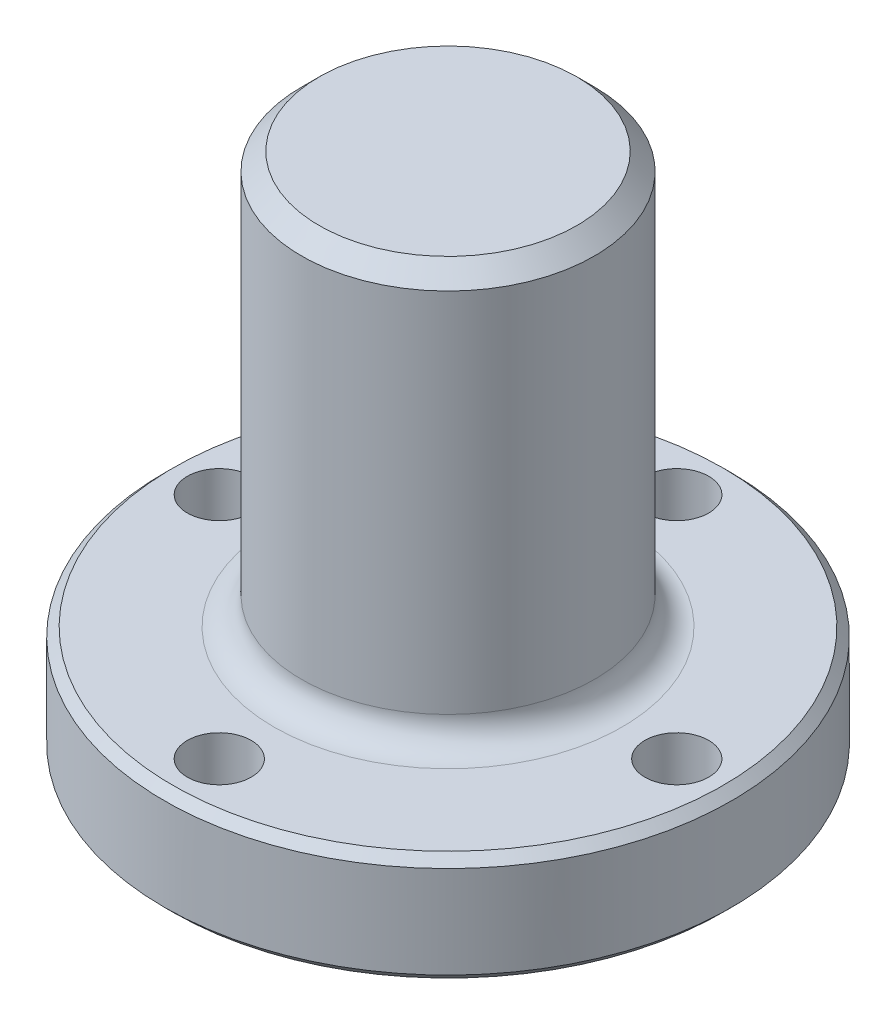
ISO-10303-21;
HEADER;
FILE_DESCRIPTION(('STEP AP214'),'2;1');
FILE_NAME('part.step','',(''),(''),'','','');
FILE_SCHEMA(('AUTOMOTIVE_DESIGN { 1 0 10303 214 1 1 1 1 }'));
ENDSEC;
DATA;
#1=APPLICATION_CONTEXT('core data for automotive mechanical design processes');
#2=APPLICATION_PROTOCOL_DEFINITION('international standard','automotive_design',2000,#1);
#3=PRODUCT_CONTEXT('',#1,'mechanical');
#4=PRODUCT('Part','Part','',(#3));
#5=PRODUCT_RELATED_PRODUCT_CATEGORY('part','',(#4));
#6=PRODUCT_DEFINITION_FORMATION('','',#4);
#7=PRODUCT_DEFINITION_CONTEXT('part definition',#1,'design');
#8=PRODUCT_DEFINITION('design','',#6,#7);
#9=PRODUCT_DEFINITION_SHAPE('','',#8);
#10=(LENGTH_UNIT() NAMED_UNIT(*) SI_UNIT(.MILLI.,.METRE.));
#11=(NAMED_UNIT(*) PLANE_ANGLE_UNIT() SI_UNIT($,.RADIAN.));
#12=(NAMED_UNIT(*) SI_UNIT($,.STERADIAN.) SOLID_ANGLE_UNIT());
#13=UNCERTAINTY_MEASURE_WITH_UNIT(LENGTH_MEASURE(1.E-05),#10,'distance_accuracy_value','');
#14=(GEOMETRIC_REPRESENTATION_CONTEXT(3) GLOBAL_UNCERTAINTY_ASSIGNED_CONTEXT((#13)) GLOBAL_UNIT_ASSIGNED_CONTEXT((#10,
#11,#12)) REPRESENTATION_CONTEXT('',''));
#15=CARTESIAN_POINT('',(0.,0.,0.));
#16=DIRECTION('',(0.,0.,1.));
#17=DIRECTION('',(1.,0.,0.));
#18=AXIS2_PLACEMENT_3D('',#15,#16,#17);
#19=CARTESIAN_POINT('',(0.,-25.0317,0.));
#20=DIRECTION('',(0.,1.,0.));
#21=DIRECTION('',(0.,0.,1.));
#22=AXIS2_PLACEMENT_3D('',#19,#20,#21);
#23=PLANE('',#22);
#24=CARTESIAN_POINT('',(0.,-25.0317,0.));
#25=DIRECTION('',(0.,-1.,0.));
#26=DIRECTION('',(0.,0.,-1.));
#27=AXIS2_PLACEMENT_3D('',#24,#25,#26);
#28=CIRCLE('',#27,8.7122);
#29=CARTESIAN_POINT('',(0.,-25.0317,-8.7122));
#30=VERTEX_POINT('',#29);
#31=EDGE_CURVE('E76',#30,#30,#28,.T.);
#32=ORIENTED_EDGE('',*,*,#31,.T.);
#33=EDGE_LOOP('',(#32));
#34=FACE_BOUND('',#33,.T.);
#35=ADVANCED_FACE('F43',(#34),#23,.F.);
#36=CARTESIAN_POINT('',(0.,-50.4317,0.));
#37=DIRECTION('',(0.,-1.,0.));
#38=DIRECTION('',(0.,0.,-1.));
#39=AXIS2_PLACEMENT_3D('',#36,#37,#38);
#40=CYLINDRICAL_SURFACE('',#39,8.7122);
#41=ORIENTED_EDGE('',*,*,#31,.F.);
#42=EDGE_LOOP('',(#41));
#43=FACE_BOUND('',#42,.T.);
#44=CARTESIAN_POINT('',(0.,-20.2057,0.));
#45=DIRECTION('',(0.,-1.,0.));
#46=DIRECTION('',(0.,0.,-1.));
#47=AXIS2_PLACEMENT_3D('',#44,#45,#46);
#48=CIRCLE('',#47,8.7122);
#49=CARTESIAN_POINT('',(0.,-20.2057,-8.7122));
#50=VERTEX_POINT('',#49);
#51=EDGE_CURVE('E79',#50,#50,#48,.T.);
#52=ORIENTED_EDGE('',*,*,#51,.T.);
#53=EDGE_LOOP('',(#52));
#54=FACE_BOUND('',#53,.T.);
#55=ADVANCED_FACE('F147',(#43,#54),#40,.T.);
#56=CARTESIAN_POINT('',(-8.7122,-20.2057,0.));
#57=DIRECTION('',(0.,1.,0.));
#58=DIRECTION('',(0.,0.,1.));
#59=AXIS2_PLACEMENT_3D('',#56,#57,#58);
#60=PLANE('',#59);
#61=CARTESIAN_POINT('',(0.,-20.2057,0.));
#62=DIRECTION('',(0.,1.,0.));
#63=DIRECTION('',(0.,0.,1.));
#64=AXIS2_PLACEMENT_3D('',#61,#62,#63);
#65=CIRCLE('',#64,23.8506);
#66=CARTESIAN_POINT('',(0.,-20.2057,23.8506));
#67=VERTEX_POINT('',#66);
#68=EDGE_CURVE('E55',#67,#67,#65,.F.);
#69=ORIENTED_EDGE('',*,*,#68,.T.);
#70=EDGE_LOOP('',(#69));
#71=FACE_BOUND('',#70,.T.);
#72=CARTESIAN_POINT('',(-19.8374,-20.2057,0.));
#73=DIRECTION('',(0.,1.,0.));
#74=DIRECTION('',(0.,0.,1.));
#75=AXIS2_PLACEMENT_3D('',#72,#73,#74);
#76=CIRCLE('',#75,2.7686);
#77=CARTESIAN_POINT('',(-19.8374,-20.2057,2.7686));
#78=VERTEX_POINT('',#77);
#79=EDGE_CURVE('E82',#78,#78,#76,.T.);
#80=ORIENTED_EDGE('',*,*,#79,.T.);
#81=EDGE_LOOP('',(#80));
#82=FACE_BOUND('',#81,.T.);
#83=CARTESIAN_POINT('',(0.,-20.2057,19.8374));
#84=DIRECTION('',(0.,1.,0.));
#85=DIRECTION('',(0.,0.,1.));
#86=AXIS2_PLACEMENT_3D('',#83,#84,#85);
#87=CIRCLE('',#86,2.7686);
#88=CARTESIAN_POINT('',(0.,-20.2057,22.606));
#89=VERTEX_POINT('',#88);
#90=EDGE_CURVE('E95',#89,#89,#87,.T.);
#91=ORIENTED_EDGE('',*,*,#90,.T.);
#92=EDGE_LOOP('',(#91));
#93=FACE_BOUND('',#92,.T.);
#94=CARTESIAN_POINT('',(19.8374,-20.2057,0.));
#95=DIRECTION('',(0.,1.,0.));
#96=DIRECTION('',(0.,0.,1.));
#97=AXIS2_PLACEMENT_3D('',#94,#95,#96);
#98=CIRCLE('',#97,2.7686);
#99=CARTESIAN_POINT('',(19.8374,-20.2057,2.7686));
#100=VERTEX_POINT('',#99);
#101=EDGE_CURVE('E89',#100,#100,#98,.T.);
#102=ORIENTED_EDGE('',*,*,#101,.T.);
#103=EDGE_LOOP('',(#102));
#104=FACE_BOUND('',#103,.T.);
#105=CARTESIAN_POINT('',(0.,-20.2057,-19.8374));
#106=DIRECTION('',(0.,1.,0.));
#107=DIRECTION('',(0.,0.,1.));
#108=AXIS2_PLACEMENT_3D('',#105,#106,#107);
#109=CIRCLE('',#108,2.7686);
#110=CARTESIAN_POINT('',(0.,-20.2057,-17.0688));
#111=VERTEX_POINT('',#110);
#112=EDGE_CURVE('E83',#111,#111,#109,.T.);
#113=ORIENTED_EDGE('',*,*,#112,.T.);
#114=EDGE_LOOP('',(#113));
#115=FACE_BOUND('',#114,.T.);
#116=ORIENTED_EDGE('',*,*,#51,.F.);
#117=EDGE_LOOP('',(#116));
#118=FACE_BOUND('',#117,.T.);
#119=ADVANCED_FACE('F107',(#71,#82,#93,#104,#115,#118),#60,.F.);
#120=CARTESIAN_POINT('',(0.,-50.4317,0.));
#121=DIRECTION('',(0.,-1.,0.));
#122=DIRECTION('',(0.,0.,-1.));
#123=AXIS2_PLACEMENT_3D('',#120,#121,#122);
#124=CYLINDRICAL_SURFACE('',#123,24.6126);
#125=CARTESIAN_POINT('',(0.,-11.4427,0.));
#126=DIRECTION('',(0.,-1.,0.));
#127=DIRECTION('',(0.,0.,-1.));
#128=AXIS2_PLACEMENT_3D('',#125,#126,#127);
#129=CIRCLE('',#128,24.6126);
#130=CARTESIAN_POINT('',(0.,-11.4427,-24.6126));
#131=VERTEX_POINT('',#130);
#132=EDGE_CURVE('E64',#131,#131,#129,.T.);
#133=ORIENTED_EDGE('',*,*,#132,.T.);
#134=EDGE_LOOP('',(#133));
#135=FACE_BOUND('',#134,.T.);
#136=CARTESIAN_POINT('',(0.,-19.4437,0.));
#137=DIRECTION('',(0.,1.,0.));
#138=DIRECTION('',(0.,0.,1.));
#139=AXIS2_PLACEMENT_3D('',#136,#137,#138);
#140=CIRCLE('',#139,24.6126);
#141=CARTESIAN_POINT('',(0.,-19.4437,24.6126));
#142=VERTEX_POINT('',#141);
#143=EDGE_CURVE('E67',#142,#142,#140,.T.);
#144=ORIENTED_EDGE('',*,*,#143,.T.);
#145=EDGE_LOOP('',(#144));
#146=FACE_BOUND('',#145,.T.);
#147=ADVANCED_FACE('F122',(#135,#146),#124,.T.);
#148=CARTESIAN_POINT('',(-24.6126,-10.6807,0.));
#149=DIRECTION('',(0.,-1.,0.));
#150=DIRECTION('',(0.,0.,-1.));
#151=AXIS2_PLACEMENT_3D('',#148,#149,#150);
#152=PLANE('',#151);
#153=CARTESIAN_POINT('',(0.,-10.6807,0.));
#154=DIRECTION('',(0.,-1.,0.));
#155=DIRECTION('',(0.,0.,-1.));
#156=AXIS2_PLACEMENT_3D('',#153,#154,#155);
#157=CIRCLE('',#156,23.8506);
#158=CARTESIAN_POINT('',(0.,-10.6807,-23.8506));
#159=VERTEX_POINT('',#158);
#160=EDGE_CURVE('E59',#159,#159,#157,.F.);
#161=ORIENTED_EDGE('',*,*,#160,.T.);
#162=EDGE_LOOP('',(#161));
#163=FACE_BOUND('',#162,.T.);
#164=CARTESIAN_POINT('',(0.,-10.6807,0.));
#165=DIRECTION('',(0.,-1.,0.));
#166=DIRECTION('',(0.,0.,-1.));
#167=AXIS2_PLACEMENT_3D('',#164,#165,#166);
#168=CIRCLE('',#167,15.0876);
#169=CARTESIAN_POINT('',(0.,-10.6807,-15.0876));
#170=VERTEX_POINT('',#169);
#171=EDGE_CURVE('E73',#170,#170,#168,.T.);
#172=ORIENTED_EDGE('',*,*,#171,.T.);
#173=EDGE_LOOP('',(#172));
#174=FACE_BOUND('',#173,.T.);
#175=CARTESIAN_POINT('',(-19.8374,-10.6807,0.));
#176=DIRECTION('',(0.,-1.,0.));
#177=DIRECTION('',(0.,0.,-1.));
#178=AXIS2_PLACEMENT_3D('',#175,#176,#177);
#179=CIRCLE('',#178,2.7686);
#180=CARTESIAN_POINT('',(-19.8374,-10.6807,-2.7686));
#181=VERTEX_POINT('',#180);
#182=EDGE_CURVE('E101',#181,#181,#179,.T.);
#183=ORIENTED_EDGE('',*,*,#182,.T.);
#184=EDGE_LOOP('',(#183));
#185=FACE_BOUND('',#184,.T.);
#186=CARTESIAN_POINT('',(0.,-10.6807,19.8374));
#187=DIRECTION('',(0.,-1.,0.));
#188=DIRECTION('',(0.,0.,-1.));
#189=AXIS2_PLACEMENT_3D('',#186,#187,#188);
#190=CIRCLE('',#189,2.7686);
#191=CARTESIAN_POINT('',(0.,-10.6807,17.0688));
#192=VERTEX_POINT('',#191);
#193=EDGE_CURVE('E98',#192,#192,#190,.T.);
#194=ORIENTED_EDGE('',*,*,#193,.T.);
#195=EDGE_LOOP('',(#194));
#196=FACE_BOUND('',#195,.T.);
#197=CARTESIAN_POINT('',(19.8374,-10.6807,0.));
#198=DIRECTION('',(0.,-1.,0.));
#199=DIRECTION('',(0.,0.,-1.));
#200=AXIS2_PLACEMENT_3D('',#197,#198,#199);
#201=CIRCLE('',#200,2.7686);
#202=CARTESIAN_POINT('',(19.8374,-10.6807,-2.7686));
#203=VERTEX_POINT('',#202);
#204=EDGE_CURVE('E92',#203,#203,#201,.T.);
#205=ORIENTED_EDGE('',*,*,#204,.T.);
#206=EDGE_LOOP('',(#205));
#207=FACE_BOUND('',#206,.T.);
#208=CARTESIAN_POINT('',(0.,-10.6807,-19.8374));
#209=DIRECTION('',(0.,-1.,0.));
#210=DIRECTION('',(0.,0.,-1.));
#211=AXIS2_PLACEMENT_3D('',#208,#209,#210);
#212=CIRCLE('',#211,2.7686);
#213=CARTESIAN_POINT('',(0.,-10.6807,-22.606));
#214=VERTEX_POINT('',#213);
#215=EDGE_CURVE('E86',#214,#214,#212,.T.);
#216=ORIENTED_EDGE('',*,*,#215,.T.);
#217=EDGE_LOOP('',(#216));
#218=FACE_BOUND('',#217,.T.);
#219=ADVANCED_FACE('F118',(#163,#174,#185,#196,#207,#218),#152,.F.);
#220=CARTESIAN_POINT('',(0.,-50.4317,0.));
#221=DIRECTION('',(0.,-1.,0.));
#222=DIRECTION('',(0.,0.,-1.));
#223=AXIS2_PLACEMENT_3D('',#220,#221,#222);
#224=CYLINDRICAL_SURFACE('',#223,12.7);
#225=CARTESIAN_POINT('',(0.,23.5077,0.));
#226=DIRECTION('',(0.,-1.,0.));
#227=DIRECTION('',(0.,0.,-1.));
#228=AXIS2_PLACEMENT_3D('',#225,#226,#227);
#229=CIRCLE('',#228,12.7);
#230=CARTESIAN_POINT('',(0.,23.5077,-12.7));
#231=VERTEX_POINT('',#230);
#232=EDGE_CURVE('E51',#231,#231,#229,.T.);
#233=ORIENTED_EDGE('',*,*,#232,.T.);
#234=EDGE_LOOP('',(#233));
#235=FACE_BOUND('',#234,.T.);
#236=CARTESIAN_POINT('',(0.,-8.2931,0.));
#237=DIRECTION('',(0.,-1.,0.));
#238=DIRECTION('',(0.,0.,-1.));
#239=AXIS2_PLACEMENT_3D('',#236,#237,#238);
#240=CIRCLE('',#239,12.7);
#241=CARTESIAN_POINT('',(0.,-8.2931,-12.7));
#242=VERTEX_POINT('',#241);
#243=EDGE_CURVE('E70',#242,#242,#240,.F.);
#244=ORIENTED_EDGE('',*,*,#243,.T.);
#245=EDGE_LOOP('',(#244));
#246=FACE_BOUND('',#245,.T.);
#247=ADVANCED_FACE('F121',(#235,#246),#224,.T.);
#248=CARTESIAN_POINT('',(-12.7,25.0317,0.));
#249=DIRECTION('',(0.,-1.,0.));
#250=DIRECTION('',(0.,0.,-1.));
#251=AXIS2_PLACEMENT_3D('',#248,#249,#250);
#252=PLANE('',#251);
#253=CARTESIAN_POINT('',(0.,25.0317,0.));
#254=DIRECTION('',(0.,-1.,0.));
#255=DIRECTION('',(0.,0.,-1.));
#256=AXIS2_PLACEMENT_3D('',#253,#254,#255);
#257=CIRCLE('',#256,11.176);
#258=CARTESIAN_POINT('',(0.,25.0317,-11.176));
#259=VERTEX_POINT('',#258);
#260=EDGE_CURVE('E10',#259,#259,#257,.F.);
#261=ORIENTED_EDGE('',*,*,#260,.T.);
#262=EDGE_LOOP('',(#261));
#263=FACE_BOUND('',#262,.T.);
#264=ADVANCED_FACE('F134',(#263),#252,.F.);
#265=CARTESIAN_POINT('',(0.,25.0317,-19.8374));
#266=DIRECTION('',(0.,-1.,0.));
#267=DIRECTION('',(0.,0.,-1.));
#268=AXIS2_PLACEMENT_3D('',#265,#266,#267);
#269=CYLINDRICAL_SURFACE('',#268,2.7686);
#270=ORIENTED_EDGE('',*,*,#112,.F.);
#271=EDGE_LOOP('',(#270));
#272=FACE_BOUND('',#271,.T.);
#273=ORIENTED_EDGE('',*,*,#215,.F.);
#274=EDGE_LOOP('',(#273));
#275=FACE_BOUND('',#274,.T.);
#276=ADVANCED_FACE('F131',(#272,#275),#269,.F.);
#277=CARTESIAN_POINT('',(19.8374,25.0317,0.));
#278=DIRECTION('',(0.,-1.,0.));
#279=DIRECTION('',(0.,0.,-1.));
#280=AXIS2_PLACEMENT_3D('',#277,#278,#279);
#281=CYLINDRICAL_SURFACE('',#280,2.7686);
#282=ORIENTED_EDGE('',*,*,#101,.F.);
#283=EDGE_LOOP('',(#282));
#284=FACE_BOUND('',#283,.T.);
#285=ORIENTED_EDGE('',*,*,#204,.F.);
#286=EDGE_LOOP('',(#285));
#287=FACE_BOUND('',#286,.T.);
#288=ADVANCED_FACE('F133',(#284,#287),#281,.F.);
#289=CARTESIAN_POINT('',(0.,25.0317,19.8374));
#290=DIRECTION('',(0.,-1.,0.));
#291=DIRECTION('',(0.,0.,-1.));
#292=AXIS2_PLACEMENT_3D('',#289,#290,#291);
#293=CYLINDRICAL_SURFACE('',#292,2.7686);
#294=ORIENTED_EDGE('',*,*,#90,.F.);
#295=EDGE_LOOP('',(#294));
#296=FACE_BOUND('',#295,.T.);
#297=ORIENTED_EDGE('',*,*,#193,.F.);
#298=EDGE_LOOP('',(#297));
#299=FACE_BOUND('',#298,.T.);
#300=ADVANCED_FACE('F114',(#296,#299),#293,.F.);
#301=CARTESIAN_POINT('',(-19.8374,25.0317,0.));
#302=DIRECTION('',(0.,-1.,0.));
#303=DIRECTION('',(0.,0.,-1.));
#304=AXIS2_PLACEMENT_3D('',#301,#302,#303);
#305=CYLINDRICAL_SURFACE('',#304,2.7686);
#306=ORIENTED_EDGE('',*,*,#79,.F.);
#307=EDGE_LOOP('',(#306));
#308=FACE_BOUND('',#307,.T.);
#309=ORIENTED_EDGE('',*,*,#182,.F.);
#310=EDGE_LOOP('',(#309));
#311=FACE_BOUND('',#310,.T.);
#312=ADVANCED_FACE('F110',(#308,#311),#305,.F.);
#313=CARTESIAN_POINT('',(0.,-8.2931,0.));
#314=DIRECTION('',(0.,-1.,0.));
#315=DIRECTION('',(0.,0.,-1.));
#316=AXIS2_PLACEMENT_3D('',#313,#314,#315);
#317=TOROIDAL_SURFACE('',#316,15.0876,2.3876);
#318=ORIENTED_EDGE('',*,*,#243,.F.);
#319=EDGE_LOOP('',(#318));
#320=FACE_BOUND('',#319,.T.);
#321=ORIENTED_EDGE('',*,*,#171,.F.);
#322=EDGE_LOOP('',(#321));
#323=FACE_BOUND('',#322,.T.);
#324=ADVANCED_FACE('F113',(#320,#323),#317,.F.);
#325=CARTESIAN_POINT('',(0.,-11.4427,0.));
#326=DIRECTION('',(0.,-1.,0.));
#327=DIRECTION('',(0.,0.,-1.));
#328=AXIS2_PLACEMENT_3D('',#325,#326,#327);
#329=CONICAL_SURFACE('',#328,24.6126,0.785398163397457);
#330=ORIENTED_EDGE('',*,*,#160,.F.);
#331=EDGE_LOOP('',(#330));
#332=FACE_BOUND('',#331,.T.);
#333=ORIENTED_EDGE('',*,*,#132,.F.);
#334=EDGE_LOOP('',(#333));
#335=FACE_BOUND('',#334,.T.);
#336=ADVANCED_FACE('F158',(#332,#335),#329,.T.);
#337=CARTESIAN_POINT('',(0.,-20.2057,0.));
#338=DIRECTION('',(0.,1.,0.));
#339=DIRECTION('',(0.,0.,1.));
#340=AXIS2_PLACEMENT_3D('',#337,#338,#339);
#341=CONICAL_SURFACE('',#340,23.8506,0.785398163397432);
#342=ORIENTED_EDGE('',*,*,#143,.F.);
#343=EDGE_LOOP('',(#342));
#344=FACE_BOUND('',#343,.T.);
#345=ORIENTED_EDGE('',*,*,#68,.F.);
#346=EDGE_LOOP('',(#345));
#347=FACE_BOUND('',#346,.T.);
#348=ADVANCED_FACE('F165',(#344,#347),#341,.T.);
#349=CARTESIAN_POINT('',(0.,23.5077,0.));
#350=DIRECTION('',(0.,-1.,0.));
#351=DIRECTION('',(0.,0.,-1.));
#352=AXIS2_PLACEMENT_3D('',#349,#350,#351);
#353=CONICAL_SURFACE('',#352,12.7,0.785398163397454);
#354=ORIENTED_EDGE('',*,*,#260,.F.);
#355=EDGE_LOOP('',(#354));
#356=FACE_BOUND('',#355,.T.);
#357=ORIENTED_EDGE('',*,*,#232,.F.);
#358=EDGE_LOOP('',(#357));
#359=FACE_BOUND('',#358,.T.);
#360=ADVANCED_FACE('F46',(#356,#359),#353,.T.);
#361=CLOSED_SHELL('',(#35,#55,#119,#147,#219,#247,#264,#276,#288,#300,#312,#324,#336,#348,#360));
#362=MANIFOLD_SOLID_BREP('B2',#361);
#363=ADVANCED_BREP_SHAPE_REPRESENTATION('',(#18,#362),#14);
#364=SHAPE_DEFINITION_REPRESENTATION(#9,#363);
ENDSEC;
END-ISO-10303-21;
